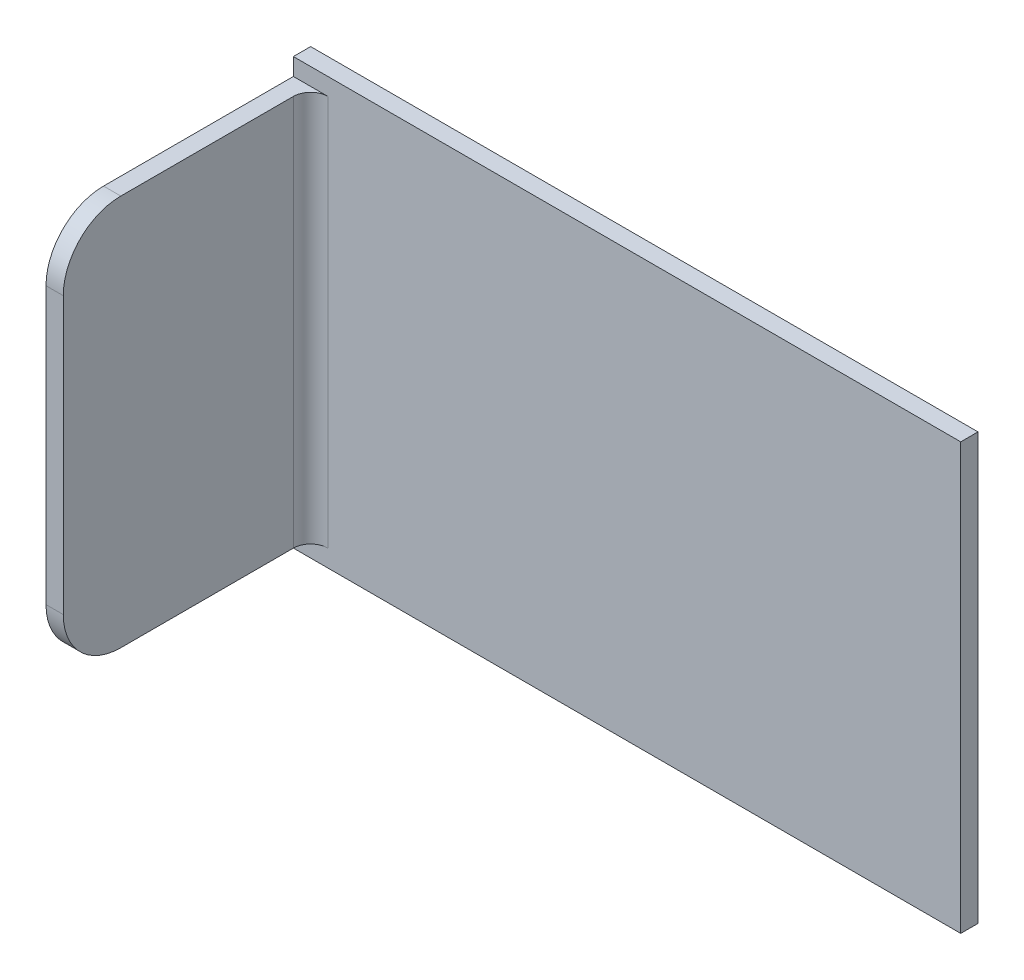
ISO-10303-21;
HEADER;
FILE_DESCRIPTION(('STEP AP214'),'2;1');
FILE_NAME('part.step','',(''),(''),'','','');
FILE_SCHEMA(('AUTOMOTIVE_DESIGN { 1 0 10303 214 1 1 1 1 }'));
ENDSEC;
DATA;
#1=APPLICATION_CONTEXT('core data for automotive mechanical design processes');
#2=APPLICATION_PROTOCOL_DEFINITION('international standard','automotive_design',2000,#1);
#3=PRODUCT_CONTEXT('',#1,'mechanical');
#4=PRODUCT('Part','Part','',(#3));
#5=PRODUCT_RELATED_PRODUCT_CATEGORY('part','',(#4));
#6=PRODUCT_DEFINITION_FORMATION('','',#4);
#7=PRODUCT_DEFINITION_CONTEXT('part definition',#1,'design');
#8=PRODUCT_DEFINITION('design','',#6,#7);
#9=PRODUCT_DEFINITION_SHAPE('','',#8);
#10=(LENGTH_UNIT() NAMED_UNIT(*) SI_UNIT(.MILLI.,.METRE.));
#11=(NAMED_UNIT(*) PLANE_ANGLE_UNIT() SI_UNIT($,.RADIAN.));
#12=(NAMED_UNIT(*) SI_UNIT($,.STERADIAN.) SOLID_ANGLE_UNIT());
#13=UNCERTAINTY_MEASURE_WITH_UNIT(LENGTH_MEASURE(1.E-05),#10,'distance_accuracy_value','');
#14=(GEOMETRIC_REPRESENTATION_CONTEXT(3) GLOBAL_UNCERTAINTY_ASSIGNED_CONTEXT((#13)) GLOBAL_UNIT_ASSIGNED_CONTEXT((#10,
#11,#12)) REPRESENTATION_CONTEXT('',''));
#15=CARTESIAN_POINT('',(0.,0.,0.));
#16=DIRECTION('',(0.,0.,1.));
#17=DIRECTION('',(1.,0.,0.));
#18=AXIS2_PLACEMENT_3D('',#15,#16,#17);
#19=CARTESIAN_POINT('',(58.,37.,3.));
#20=DIRECTION('',(-1.,0.,0.));
#21=DIRECTION('',(0.,-1.,0.));
#22=AXIS2_PLACEMENT_3D('',#19,#20,#21);
#23=PLANE('',#22);
#24=DIRECTION('',(0.,1.,0.));
#25=VECTOR('',#24,1.);
#26=CARTESIAN_POINT('',(58.,37.,0.));
#27=LINE('',#26,#25);
#28=CARTESIAN_POINT('',(58.,-37.,0.));
#29=VERTEX_POINT('',#28);
#30=CARTESIAN_POINT('',(58.,37.,0.));
#31=VERTEX_POINT('',#30);
#32=EDGE_CURVE('E176',#29,#31,#27,.T.);
#33=ORIENTED_EDGE('',*,*,#32,.T.);
#34=DIRECTION('',(0.,0.,-1.));
#35=VECTOR('',#34,1.);
#36=CARTESIAN_POINT('',(58.,37.,3.));
#37=LINE('',#36,#35);
#38=CARTESIAN_POINT('',(58.,37.,3.));
#39=VERTEX_POINT('',#38);
#40=EDGE_CURVE('E227',#39,#31,#37,.T.);
#41=ORIENTED_EDGE('',*,*,#40,.F.);
#42=DIRECTION('',(0.,1.,0.));
#43=VECTOR('',#42,1.);
#44=CARTESIAN_POINT('',(58.,37.,3.));
#45=LINE('',#44,#43);
#46=CARTESIAN_POINT('',(58.,-37.,3.));
#47=VERTEX_POINT('',#46);
#48=EDGE_CURVE('E188',#47,#39,#45,.T.);
#49=ORIENTED_EDGE('',*,*,#48,.F.);
#50=DIRECTION('',(0.,0.,-1.));
#51=VECTOR('',#50,1.);
#52=CARTESIAN_POINT('',(58.,-37.,3.));
#53=LINE('',#52,#51);
#54=EDGE_CURVE('E204',#47,#29,#53,.T.);
#55=ORIENTED_EDGE('',*,*,#54,.T.);
#56=EDGE_LOOP('',(#33,#41,#49,#55));
#57=FACE_BOUND('',#56,.T.);
#58=ADVANCED_FACE('F39',(#57),#23,.F.);
#59=CARTESIAN_POINT('',(-58.,37.,3.));
#60=DIRECTION('',(0.,-1.,0.));
#61=DIRECTION('',(0.,0.,-1.));
#62=AXIS2_PLACEMENT_3D('',#59,#60,#61);
#63=PLANE('',#62);
#64=DIRECTION('',(-1.,0.,0.));
#65=VECTOR('',#64,1.);
#66=CARTESIAN_POINT('',(-58.,37.,0.));
#67=LINE('',#66,#65);
#68=CARTESIAN_POINT('',(-58.,37.,0.));
#69=VERTEX_POINT('',#68);
#70=EDGE_CURVE('E208',#31,#69,#67,.T.);
#71=ORIENTED_EDGE('',*,*,#70,.T.);
#72=DIRECTION('',(0.,0.,-1.));
#73=VECTOR('',#72,1.);
#74=CARTESIAN_POINT('',(-58.,37.,3.));
#75=LINE('',#74,#73);
#76=CARTESIAN_POINT('',(-58.,37.,3.));
#77=VERTEX_POINT('',#76);
#78=EDGE_CURVE('E223',#77,#69,#75,.T.);
#79=ORIENTED_EDGE('',*,*,#78,.F.);
#80=DIRECTION('',(-1.,0.,0.));
#81=VECTOR('',#80,1.);
#82=CARTESIAN_POINT('',(-58.,37.,3.));
#83=LINE('',#82,#81);
#84=EDGE_CURVE('E192',#39,#77,#83,.T.);
#85=ORIENTED_EDGE('',*,*,#84,.F.);
#86=ORIENTED_EDGE('',*,*,#40,.T.);
#87=EDGE_LOOP('',(#71,#79,#85,#86));
#88=FACE_BOUND('',#87,.T.);
#89=ADVANCED_FACE('F257',(#88),#63,.F.);
#90=CARTESIAN_POINT('',(-58.,37.,3.));
#91=DIRECTION('',(1.,0.,0.));
#92=DIRECTION('',(0.,1.,0.));
#93=AXIS2_PLACEMENT_3D('',#90,#91,#92);
#94=PLANE('',#93);
#95=DIRECTION('',(0.,-1.,0.));
#96=VECTOR('',#95,1.);
#97=CARTESIAN_POINT('',(-58.,37.,0.));
#98=LINE('',#97,#96);
#99=CARTESIAN_POINT('',(-58.,-37.,0.));
#100=VERTEX_POINT('',#99);
#101=EDGE_CURVE('E211',#69,#100,#98,.T.);
#102=ORIENTED_EDGE('',*,*,#101,.T.);
#103=DIRECTION('',(0.,0.,-1.));
#104=VECTOR('',#103,1.);
#105=CARTESIAN_POINT('',(-58.,-37.,3.));
#106=LINE('',#105,#104);
#107=CARTESIAN_POINT('',(-58.,-37.,3.));
#108=VERTEX_POINT('',#107);
#109=EDGE_CURVE('E219',#108,#100,#106,.T.);
#110=ORIENTED_EDGE('',*,*,#109,.F.);
#111=DIRECTION('',(0.,-1.,0.));
#112=VECTOR('',#111,1.);
#113=CARTESIAN_POINT('',(-58.,37.,3.));
#114=LINE('',#113,#112);
#115=CARTESIAN_POINT('',(-58.,-34.,3.));
#116=VERTEX_POINT('',#115);
#117=EDGE_CURVE('E196',#116,#108,#114,.T.);
#118=ORIENTED_EDGE('',*,*,#117,.F.);
#119=DIRECTION('',(0.,0.,1.));
#120=VECTOR('',#119,1.);
#121=CARTESIAN_POINT('',(-58.,-34.,36.));
#122=LINE('',#121,#120);
#123=CARTESIAN_POINT('',(-58.,-34.,36.));
#124=VERTEX_POINT('',#123);
#125=EDGE_CURVE('E157',#116,#124,#122,.T.);
#126=ORIENTED_EDGE('',*,*,#125,.T.);
#127=CARTESIAN_POINT('',(-58.,-24.,36.));
#128=DIRECTION('',(-1.,0.,0.));
#129=DIRECTION('',(0.,1.,0.));
#130=AXIS2_PLACEMENT_3D('',#127,#128,#129);
#131=CIRCLE('',#130,10.);
#132=CARTESIAN_POINT('',(-58.,-24.,46.));
#133=VERTEX_POINT('',#132);
#134=EDGE_CURVE('E134',#124,#133,#131,.T.);
#135=ORIENTED_EDGE('',*,*,#134,.T.);
#136=DIRECTION('',(0.,1.,0.));
#137=VECTOR('',#136,1.);
#138=CARTESIAN_POINT('',(-58.,24.,46.));
#139=LINE('',#138,#137);
#140=CARTESIAN_POINT('',(-58.,24.,46.));
#141=VERTEX_POINT('',#140);
#142=EDGE_CURVE('E162',#133,#141,#139,.T.);
#143=ORIENTED_EDGE('',*,*,#142,.T.);
#144=CARTESIAN_POINT('',(-58.,24.,36.));
#145=DIRECTION('',(-1.,0.,0.));
#146=DIRECTION('',(0.,1.,0.));
#147=AXIS2_PLACEMENT_3D('',#144,#145,#146);
#148=CIRCLE('',#147,10.);
#149=CARTESIAN_POINT('',(-58.,34.,36.));
#150=VERTEX_POINT('',#149);
#151=EDGE_CURVE('E166',#141,#150,#148,.T.);
#152=ORIENTED_EDGE('',*,*,#151,.T.);
#153=DIRECTION('',(0.,0.,-1.));
#154=VECTOR('',#153,1.);
#155=CARTESIAN_POINT('',(-58.,34.,3.));
#156=LINE('',#155,#154);
#157=CARTESIAN_POINT('',(-58.,34.,3.));
#158=VERTEX_POINT('',#157);
#159=EDGE_CURVE('E128',#150,#158,#156,.T.);
#160=ORIENTED_EDGE('',*,*,#159,.T.);
#161=EDGE_CURVE('E197',#77,#158,#114,.T.);
#162=ORIENTED_EDGE('',*,*,#161,.F.);
#163=ORIENTED_EDGE('',*,*,#78,.T.);
#164=EDGE_LOOP('',(#102,#110,#118,#126,#135,#143,#152,#160,#162,#163));
#165=FACE_BOUND('',#164,.T.);
#166=ADVANCED_FACE('F245',(#165),#94,.F.);
#167=CARTESIAN_POINT('',(-58.,-37.,3.));
#168=DIRECTION('',(0.,1.,0.));
#169=DIRECTION('',(0.,0.,1.));
#170=AXIS2_PLACEMENT_3D('',#167,#168,#169);
#171=PLANE('',#170);
#172=DIRECTION('',(1.,0.,0.));
#173=VECTOR('',#172,1.);
#174=CARTESIAN_POINT('',(-58.,-37.,0.));
#175=LINE('',#174,#173);
#176=EDGE_CURVE('E193',#100,#29,#175,.T.);
#177=ORIENTED_EDGE('',*,*,#176,.T.);
#178=ORIENTED_EDGE('',*,*,#54,.F.);
#179=DIRECTION('',(1.,0.,0.));
#180=VECTOR('',#179,1.);
#181=CARTESIAN_POINT('',(-58.,-37.,3.));
#182=LINE('',#181,#180);
#183=EDGE_CURVE('E201',#108,#47,#182,.T.);
#184=ORIENTED_EDGE('',*,*,#183,.F.);
#185=ORIENTED_EDGE('',*,*,#109,.T.);
#186=EDGE_LOOP('',(#177,#178,#184,#185));
#187=FACE_BOUND('',#186,.T.);
#188=ADVANCED_FACE('F249',(#187),#171,.F.);
#189=CARTESIAN_POINT('',(0.,0.,3.));
#190=DIRECTION('',(0.,0.,1.));
#191=DIRECTION('',(1.,0.,0.));
#192=AXIS2_PLACEMENT_3D('',#189,#190,#191);
#193=PLANE('',#192);
#194=DIRECTION('',(0.,-1.,0.));
#195=VECTOR('',#194,1.);
#196=CARTESIAN_POINT('',(-52.,-34.,3.));
#197=LINE('',#196,#195);
#198=CARTESIAN_POINT('',(-52.,34.,3.));
#199=VERTEX_POINT('',#198);
#200=CARTESIAN_POINT('',(-52.,-34.,3.));
#201=VERTEX_POINT('',#200);
#202=EDGE_CURVE('E231',#199,#201,#197,.T.);
#203=ORIENTED_EDGE('',*,*,#202,.T.);
#204=DIRECTION('',(-1.,0.,0.));
#205=VECTOR('',#204,1.);
#206=CARTESIAN_POINT('',(-55.,-34.,3.));
#207=LINE('',#206,#205);
#208=EDGE_CURVE('E138',#201,#116,#207,.T.);
#209=ORIENTED_EDGE('',*,*,#208,.T.);
#210=ORIENTED_EDGE('',*,*,#117,.T.);
#211=ORIENTED_EDGE('',*,*,#183,.T.);
#212=ORIENTED_EDGE('',*,*,#48,.T.);
#213=ORIENTED_EDGE('',*,*,#84,.T.);
#214=ORIENTED_EDGE('',*,*,#161,.T.);
#215=DIRECTION('',(-1.,0.,0.));
#216=VECTOR('',#215,1.);
#217=CARTESIAN_POINT('',(-55.,34.,3.));
#218=LINE('',#217,#216);
#219=EDGE_CURVE('E173',#199,#158,#218,.T.);
#220=ORIENTED_EDGE('',*,*,#219,.F.);
#221=EDGE_LOOP('',(#203,#209,#210,#211,#212,#213,#214,#220));
#222=FACE_BOUND('',#221,.T.);
#223=ADVANCED_FACE('F241',(#222),#193,.T.);
#224=CARTESIAN_POINT('',(0.,0.,0.));
#225=DIRECTION('',(0.,0.,1.));
#226=DIRECTION('',(1.,0.,0.));
#227=AXIS2_PLACEMENT_3D('',#224,#225,#226);
#228=PLANE('',#227);
#229=ORIENTED_EDGE('',*,*,#32,.F.);
#230=ORIENTED_EDGE('',*,*,#176,.F.);
#231=ORIENTED_EDGE('',*,*,#101,.F.);
#232=ORIENTED_EDGE('',*,*,#70,.F.);
#233=EDGE_LOOP('',(#229,#230,#231,#232));
#234=FACE_BOUND('',#233,.T.);
#235=ADVANCED_FACE('F280',(#234),#228,.F.);
#236=CARTESIAN_POINT('',(-55.,34.,3.));
#237=DIRECTION('',(0.,1.,0.));
#238=DIRECTION('',(0.,0.,1.));
#239=AXIS2_PLACEMENT_3D('',#236,#237,#238);
#240=PLANE('',#239);
#241=ORIENTED_EDGE('',*,*,#159,.F.);
#242=DIRECTION('',(-1.,0.,0.));
#243=VECTOR('',#242,1.);
#244=CARTESIAN_POINT('',(-55.,34.,36.));
#245=LINE('',#244,#243);
#246=CARTESIAN_POINT('',(-55.,34.,36.));
#247=VERTEX_POINT('',#246);
#248=EDGE_CURVE('E177',#247,#150,#245,.T.);
#249=ORIENTED_EDGE('',*,*,#248,.F.);
#250=DIRECTION('',(0.,0.,-1.));
#251=VECTOR('',#250,1.);
#252=CARTESIAN_POINT('',(-55.,34.,3.));
#253=LINE('',#252,#251);
#254=CARTESIAN_POINT('',(-55.,34.,6.));
#255=VERTEX_POINT('',#254);
#256=EDGE_CURVE('E154',#247,#255,#253,.T.);
#257=ORIENTED_EDGE('',*,*,#256,.T.);
#258=CARTESIAN_POINT('',(-52.,34.,6.));
#259=DIRECTION('',(0.,1.,0.));
#260=DIRECTION('',(0.,0.,1.));
#261=AXIS2_PLACEMENT_3D('',#258,#259,#260);
#262=CIRCLE('',#261,3.);
#263=EDGE_CURVE('E11',#255,#199,#262,.F.);
#264=ORIENTED_EDGE('',*,*,#263,.T.);
#265=ORIENTED_EDGE('',*,*,#219,.T.);
#266=EDGE_LOOP('',(#241,#249,#257,#264,#265));
#267=FACE_BOUND('',#266,.T.);
#268=ADVANCED_FACE('F261',(#267),#240,.T.);
#269=CARTESIAN_POINT('',(-55.,24.,36.));
#270=DIRECTION('',(-1.,0.,0.));
#271=DIRECTION('',(0.,-1.,0.));
#272=AXIS2_PLACEMENT_3D('',#269,#270,#271);
#273=CYLINDRICAL_SURFACE('',#272,10.);
#274=ORIENTED_EDGE('',*,*,#151,.F.);
#275=DIRECTION('',(-1.,0.,0.));
#276=VECTOR('',#275,1.);
#277=CARTESIAN_POINT('',(-55.,24.,46.));
#278=LINE('',#277,#276);
#279=CARTESIAN_POINT('',(-55.,24.,46.));
#280=VERTEX_POINT('',#279);
#281=EDGE_CURVE('E180',#280,#141,#278,.T.);
#282=ORIENTED_EDGE('',*,*,#281,.F.);
#283=CARTESIAN_POINT('',(-55.,24.,36.));
#284=DIRECTION('',(-1.,0.,0.));
#285=DIRECTION('',(0.,1.,0.));
#286=AXIS2_PLACEMENT_3D('',#283,#284,#285);
#287=CIRCLE('',#286,10.);
#288=EDGE_CURVE('E148',#280,#247,#287,.T.);
#289=ORIENTED_EDGE('',*,*,#288,.T.);
#290=ORIENTED_EDGE('',*,*,#248,.T.);
#291=EDGE_LOOP('',(#274,#282,#289,#290));
#292=FACE_BOUND('',#291,.T.);
#293=ADVANCED_FACE('F293',(#292),#273,.T.);
#294=CARTESIAN_POINT('',(-55.,24.,46.));
#295=DIRECTION('',(0.,0.,1.));
#296=DIRECTION('',(1.,0.,0.));
#297=AXIS2_PLACEMENT_3D('',#294,#295,#296);
#298=PLANE('',#297);
#299=ORIENTED_EDGE('',*,*,#142,.F.);
#300=DIRECTION('',(-1.,0.,0.));
#301=VECTOR('',#300,1.);
#302=CARTESIAN_POINT('',(-55.,-24.,46.));
#303=LINE('',#302,#301);
#304=CARTESIAN_POINT('',(-55.,-24.,46.));
#305=VERTEX_POINT('',#304);
#306=EDGE_CURVE('E137',#305,#133,#303,.T.);
#307=ORIENTED_EDGE('',*,*,#306,.F.);
#308=DIRECTION('',(0.,1.,0.));
#309=VECTOR('',#308,1.);
#310=CARTESIAN_POINT('',(-55.,24.,46.));
#311=LINE('',#310,#309);
#312=EDGE_CURVE('E144',#305,#280,#311,.T.);
#313=ORIENTED_EDGE('',*,*,#312,.T.);
#314=ORIENTED_EDGE('',*,*,#281,.T.);
#315=EDGE_LOOP('',(#299,#307,#313,#314));
#316=FACE_BOUND('',#315,.T.);
#317=ADVANCED_FACE('F290',(#316),#298,.T.);
#318=CARTESIAN_POINT('',(-55.,-24.,36.));
#319=DIRECTION('',(-1.,0.,0.));
#320=DIRECTION('',(0.,-1.,0.));
#321=AXIS2_PLACEMENT_3D('',#318,#319,#320);
#322=CYLINDRICAL_SURFACE('',#321,10.);
#323=ORIENTED_EDGE('',*,*,#134,.F.);
#324=DIRECTION('',(-1.,0.,0.));
#325=VECTOR('',#324,1.);
#326=CARTESIAN_POINT('',(-55.,-34.,36.));
#327=LINE('',#326,#325);
#328=CARTESIAN_POINT('',(-55.,-34.,36.));
#329=VERTEX_POINT('',#328);
#330=EDGE_CURVE('E123',#329,#124,#327,.T.);
#331=ORIENTED_EDGE('',*,*,#330,.F.);
#332=CARTESIAN_POINT('',(-55.,-24.,36.));
#333=DIRECTION('',(-1.,0.,0.));
#334=DIRECTION('',(0.,1.,0.));
#335=AXIS2_PLACEMENT_3D('',#332,#333,#334);
#336=CIRCLE('',#335,10.);
#337=EDGE_CURVE('E127',#329,#305,#336,.T.);
#338=ORIENTED_EDGE('',*,*,#337,.T.);
#339=ORIENTED_EDGE('',*,*,#306,.T.);
#340=EDGE_LOOP('',(#323,#331,#338,#339));
#341=FACE_BOUND('',#340,.T.);
#342=ADVANCED_FACE('F132',(#341),#322,.T.);
#343=CARTESIAN_POINT('',(-55.,-34.,36.));
#344=DIRECTION('',(0.,-1.,0.));
#345=DIRECTION('',(0.,0.,-1.));
#346=AXIS2_PLACEMENT_3D('',#343,#344,#345);
#347=PLANE('',#346);
#348=ORIENTED_EDGE('',*,*,#125,.F.);
#349=ORIENTED_EDGE('',*,*,#208,.F.);
#350=CARTESIAN_POINT('',(-52.,-34.,6.));
#351=DIRECTION('',(0.,-1.,0.));
#352=DIRECTION('',(0.,0.,-1.));
#353=AXIS2_PLACEMENT_3D('',#350,#351,#352);
#354=CIRCLE('',#353,3.);
#355=CARTESIAN_POINT('',(-55.,-34.,6.));
#356=VERTEX_POINT('',#355);
#357=EDGE_CURVE('E48',#201,#356,#354,.F.);
#358=ORIENTED_EDGE('',*,*,#357,.T.);
#359=DIRECTION('',(0.,0.,1.));
#360=VECTOR('',#359,1.);
#361=CARTESIAN_POINT('',(-55.,-34.,36.));
#362=LINE('',#361,#360);
#363=EDGE_CURVE('E120',#356,#329,#362,.T.);
#364=ORIENTED_EDGE('',*,*,#363,.T.);
#365=ORIENTED_EDGE('',*,*,#330,.T.);
#366=EDGE_LOOP('',(#348,#349,#358,#364,#365));
#367=FACE_BOUND('',#366,.T.);
#368=ADVANCED_FACE('F122',(#367),#347,.T.);
#369=CARTESIAN_POINT('',(-55.,24.,36.));
#370=DIRECTION('',(1.,0.,0.));
#371=DIRECTION('',(0.,1.,0.));
#372=AXIS2_PLACEMENT_3D('',#369,#370,#371);
#373=PLANE('',#372);
#374=ORIENTED_EDGE('',*,*,#363,.F.);
#375=DIRECTION('',(0.,-1.,0.));
#376=VECTOR('',#375,1.);
#377=CARTESIAN_POINT('',(-55.,34.,6.));
#378=LINE('',#377,#376);
#379=EDGE_CURVE('E61',#356,#255,#378,.F.);
#380=ORIENTED_EDGE('',*,*,#379,.T.);
#381=ORIENTED_EDGE('',*,*,#256,.F.);
#382=ORIENTED_EDGE('',*,*,#288,.F.);
#383=ORIENTED_EDGE('',*,*,#312,.F.);
#384=ORIENTED_EDGE('',*,*,#337,.F.);
#385=EDGE_LOOP('',(#374,#380,#381,#382,#383,#384));
#386=FACE_BOUND('',#385,.T.);
#387=ADVANCED_FACE('F141',(#386),#373,.T.);
#388=CARTESIAN_POINT('',(-52.,0.,6.));
#389=DIRECTION('',(0.,1.,0.));
#390=DIRECTION('',(-1.,0.,0.));
#391=AXIS2_PLACEMENT_3D('',#388,#389,#390);
#392=CYLINDRICAL_SURFACE('',#391,3.);
#393=ORIENTED_EDGE('',*,*,#263,.F.);
#394=ORIENTED_EDGE('',*,*,#379,.F.);
#395=ORIENTED_EDGE('',*,*,#357,.F.);
#396=ORIENTED_EDGE('',*,*,#202,.F.);
#397=EDGE_LOOP('',(#393,#394,#395,#396));
#398=FACE_BOUND('',#397,.T.);
#399=ADVANCED_FACE('F41',(#398),#392,.F.);
#400=CLOSED_SHELL('',(#58,#89,#166,#188,#223,#235,#268,#293,#317,#342,#368,#387,#399));
#401=MANIFOLD_SOLID_BREP('B2',#400);
#402=ADVANCED_BREP_SHAPE_REPRESENTATION('',(#18,#401),#14);
#403=SHAPE_DEFINITION_REPRESENTATION(#9,#402);
ENDSEC;
END-ISO-10303-21;
